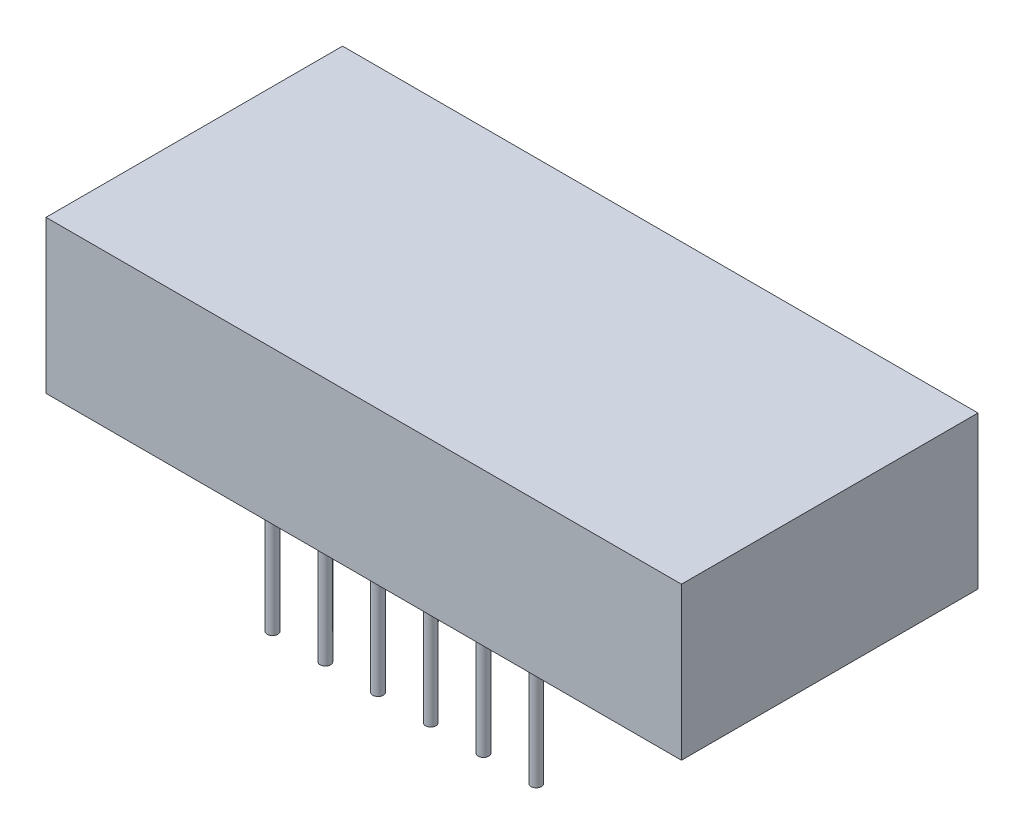
ISO-10303-21;
HEADER;
FILE_DESCRIPTION(('STEP AP214'),'2;1');
FILE_NAME('part.step','',(''),(''),'','','');
FILE_SCHEMA(('AUTOMOTIVE_DESIGN { 1 0 10303 214 1 1 1 1 }'));
ENDSEC;
DATA;
#1=APPLICATION_CONTEXT('core data for automotive mechanical design processes');
#2=APPLICATION_PROTOCOL_DEFINITION('international standard','automotive_design',2000,#1);
#3=PRODUCT_CONTEXT('',#1,'mechanical');
#4=PRODUCT('Part','Part','',(#3));
#5=PRODUCT_RELATED_PRODUCT_CATEGORY('part','',(#4));
#6=PRODUCT_DEFINITION_FORMATION('','',#4);
#7=PRODUCT_DEFINITION_CONTEXT('part definition',#1,'design');
#8=PRODUCT_DEFINITION('design','',#6,#7);
#9=PRODUCT_DEFINITION_SHAPE('','',#8);
#10=(LENGTH_UNIT() NAMED_UNIT(*) SI_UNIT(.MILLI.,.METRE.));
#11=(NAMED_UNIT(*) PLANE_ANGLE_UNIT() SI_UNIT($,.RADIAN.));
#12=(NAMED_UNIT(*) SI_UNIT($,.STERADIAN.) SOLID_ANGLE_UNIT());
#13=UNCERTAINTY_MEASURE_WITH_UNIT(LENGTH_MEASURE(1.E-05),#10,'distance_accuracy_value','');
#14=(GEOMETRIC_REPRESENTATION_CONTEXT(3) GLOBAL_UNCERTAINTY_ASSIGNED_CONTEXT((#13)) GLOBAL_UNIT_ASSIGNED_CONTEXT((#10,
#11,#12)) REPRESENTATION_CONTEXT('',''));
#15=CARTESIAN_POINT('',(0.,0.,0.));
#16=DIRECTION('',(0.,0.,1.));
#17=DIRECTION('',(1.,0.,0.));
#18=AXIS2_PLACEMENT_3D('',#15,#16,#17);
#19=CARTESIAN_POINT('',(-15.,0.,7.));
#20=DIRECTION('',(0.,1.,0.));
#21=DIRECTION('',(0.,0.,1.));
#22=AXIS2_PLACEMENT_3D('',#19,#20,#21);
#23=PLANE('',#22);
#24=CARTESIAN_POINT('',(3.73481199421592,0.,-5.08000000000001));
#25=DIRECTION('',(0.,1.,0.));
#26=DIRECTION('',(0.,0.,1.));
#27=AXIS2_PLACEMENT_3D('',#24,#25,#26);
#28=CIRCLE('',#27,0.250000000000002);
#29=CARTESIAN_POINT('',(3.73481199421592,0.,-4.83));
#30=VERTEX_POINT('',#29);
#31=EDGE_CURVE('E42',#30,#30,#28,.F.);
#32=ORIENTED_EDGE('',*,*,#31,.F.);
#33=EDGE_LOOP('',(#32));
#34=FACE_BOUND('',#33,.T.);
#35=CARTESIAN_POINT('',(-1.2449373314053,0.,-5.08000000000001));
#36=DIRECTION('',(0.,1.,0.));
#37=DIRECTION('',(0.,0.,1.));
#38=AXIS2_PLACEMENT_3D('',#35,#36,#37);
#39=CIRCLE('',#38,0.25);
#40=CARTESIAN_POINT('',(-1.2449373314053,0.,-4.83000000000001));
#41=VERTEX_POINT('',#40);
#42=EDGE_CURVE('E135',#41,#41,#39,.F.);
#43=ORIENTED_EDGE('',*,*,#42,.F.);
#44=EDGE_LOOP('',(#43));
#45=FACE_BOUND('',#44,.T.);
#46=CARTESIAN_POINT('',(-6.22468665702653,0.,-5.08000000000001));
#47=DIRECTION('',(0.,1.,0.));
#48=DIRECTION('',(0.,0.,1.));
#49=AXIS2_PLACEMENT_3D('',#46,#47,#48);
#50=CIRCLE('',#49,0.25);
#51=CARTESIAN_POINT('',(-6.22468665702653,0.,-4.83000000000001));
#52=VERTEX_POINT('',#51);
#53=EDGE_CURVE('E129',#52,#52,#50,.F.);
#54=ORIENTED_EDGE('',*,*,#53,.F.);
#55=EDGE_LOOP('',(#54));
#56=FACE_BOUND('',#55,.T.);
#57=CARTESIAN_POINT('',(-3.73481199421592,0.,5.08));
#58=DIRECTION('',(0.,1.,0.));
#59=DIRECTION('',(0.,0.,1.));
#60=AXIS2_PLACEMENT_3D('',#57,#58,#59);
#61=CIRCLE('',#60,0.25);
#62=CARTESIAN_POINT('',(-3.73481199421592,0.,5.33));
#63=VERTEX_POINT('',#62);
#64=EDGE_CURVE('E123',#63,#63,#61,.F.);
#65=ORIENTED_EDGE('',*,*,#64,.F.);
#66=EDGE_LOOP('',(#65));
#67=FACE_BOUND('',#66,.T.);
#68=CARTESIAN_POINT('',(1.2449373314053,0.,5.08));
#69=DIRECTION('',(0.,1.,0.));
#70=DIRECTION('',(0.,0.,1.));
#71=AXIS2_PLACEMENT_3D('',#68,#69,#70);
#72=CIRCLE('',#71,0.25);
#73=CARTESIAN_POINT('',(1.2449373314053,0.,5.33));
#74=VERTEX_POINT('',#73);
#75=EDGE_CURVE('E117',#74,#74,#72,.F.);
#76=ORIENTED_EDGE('',*,*,#75,.F.);
#77=EDGE_LOOP('',(#76));
#78=FACE_BOUND('',#77,.T.);
#79=CARTESIAN_POINT('',(6.22468665702653,0.,5.08));
#80=DIRECTION('',(0.,1.,0.));
#81=DIRECTION('',(0.,0.,1.));
#82=AXIS2_PLACEMENT_3D('',#79,#80,#81);
#83=CIRCLE('',#82,0.25);
#84=CARTESIAN_POINT('',(6.22468665702653,0.,5.33));
#85=VERTEX_POINT('',#84);
#86=EDGE_CURVE('E111',#85,#85,#83,.F.);
#87=ORIENTED_EDGE('',*,*,#86,.F.);
#88=EDGE_LOOP('',(#87));
#89=FACE_BOUND('',#88,.T.);
#90=DIRECTION('',(0.,0.,1.));
#91=VECTOR('',#90,1.);
#92=CARTESIAN_POINT('',(-15.,0.,-7.));
#93=LINE('',#92,#91);
#94=CARTESIAN_POINT('',(-15.,0.,-7.));
#95=VERTEX_POINT('',#94);
#96=CARTESIAN_POINT('',(-15.,0.,7.));
#97=VERTEX_POINT('',#96);
#98=EDGE_CURVE('E101',#95,#97,#93,.T.);
#99=ORIENTED_EDGE('',*,*,#98,.F.);
#100=DIRECTION('',(-1.,0.,0.));
#101=VECTOR('',#100,1.);
#102=CARTESIAN_POINT('',(-15.,0.,-7.));
#103=LINE('',#102,#101);
#104=CARTESIAN_POINT('',(15.,0.,-7.));
#105=VERTEX_POINT('',#104);
#106=EDGE_CURVE('E73',#105,#95,#103,.T.);
#107=ORIENTED_EDGE('',*,*,#106,.F.);
#108=DIRECTION('',(0.,0.,-1.));
#109=VECTOR('',#108,1.);
#110=CARTESIAN_POINT('',(15.,0.,-7.));
#111=LINE('',#110,#109);
#112=CARTESIAN_POINT('',(15.,0.,7.));
#113=VERTEX_POINT('',#112);
#114=EDGE_CURVE('E67',#113,#105,#111,.T.);
#115=ORIENTED_EDGE('',*,*,#114,.F.);
#116=DIRECTION('',(1.,0.,0.));
#117=VECTOR('',#116,1.);
#118=CARTESIAN_POINT('',(-15.,0.,7.));
#119=LINE('',#118,#117);
#120=EDGE_CURVE('E91',#97,#113,#119,.T.);
#121=ORIENTED_EDGE('',*,*,#120,.F.);
#122=EDGE_LOOP('',(#99,#107,#115,#121));
#123=FACE_BOUND('',#122,.T.);
#124=CARTESIAN_POINT('',(3.73481199421592,0.,5.08));
#125=DIRECTION('',(0.,1.,0.));
#126=DIRECTION('',(0.,0.,1.));
#127=AXIS2_PLACEMENT_3D('',#124,#125,#126);
#128=CIRCLE('',#127,0.250000000000001);
#129=CARTESIAN_POINT('',(3.73481199421592,0.,5.33));
#130=VERTEX_POINT('',#129);
#131=EDGE_CURVE('E114',#130,#130,#128,.F.);
#132=ORIENTED_EDGE('',*,*,#131,.F.);
#133=EDGE_LOOP('',(#132));
#134=FACE_BOUND('',#133,.T.);
#135=CARTESIAN_POINT('',(-1.24493733140531,0.,5.08));
#136=DIRECTION('',(0.,1.,0.));
#137=DIRECTION('',(0.,0.,1.));
#138=AXIS2_PLACEMENT_3D('',#135,#136,#137);
#139=CIRCLE('',#138,0.25);
#140=CARTESIAN_POINT('',(-1.24493733140531,0.,5.33));
#141=VERTEX_POINT('',#140);
#142=EDGE_CURVE('E120',#141,#141,#139,.F.);
#143=ORIENTED_EDGE('',*,*,#142,.F.);
#144=EDGE_LOOP('',(#143));
#145=FACE_BOUND('',#144,.T.);
#146=CARTESIAN_POINT('',(-6.22468665702653,0.,5.08));
#147=DIRECTION('',(0.,1.,0.));
#148=DIRECTION('',(0.,0.,1.));
#149=AXIS2_PLACEMENT_3D('',#146,#147,#148);
#150=CIRCLE('',#149,0.25);
#151=CARTESIAN_POINT('',(-6.22468665702653,0.,5.33));
#152=VERTEX_POINT('',#151);
#153=EDGE_CURVE('E126',#152,#152,#150,.F.);
#154=ORIENTED_EDGE('',*,*,#153,.F.);
#155=EDGE_LOOP('',(#154));
#156=FACE_BOUND('',#155,.T.);
#157=CARTESIAN_POINT('',(-3.73481199421592,0.,-5.08000000000001));
#158=DIRECTION('',(0.,1.,0.));
#159=DIRECTION('',(0.,0.,1.));
#160=AXIS2_PLACEMENT_3D('',#157,#158,#159);
#161=CIRCLE('',#160,0.250000000000001);
#162=CARTESIAN_POINT('',(-3.73481199421592,0.,-4.83000000000001));
#163=VERTEX_POINT('',#162);
#164=EDGE_CURVE('E132',#163,#163,#161,.F.);
#165=ORIENTED_EDGE('',*,*,#164,.F.);
#166=EDGE_LOOP('',(#165));
#167=FACE_BOUND('',#166,.T.);
#168=CARTESIAN_POINT('',(1.24493733140531,0.,-5.08000000000001));
#169=DIRECTION('',(0.,1.,0.));
#170=DIRECTION('',(0.,0.,1.));
#171=AXIS2_PLACEMENT_3D('',#168,#169,#170);
#172=CIRCLE('',#171,0.25);
#173=CARTESIAN_POINT('',(1.24493733140531,0.,-4.83000000000001));
#174=VERTEX_POINT('',#173);
#175=EDGE_CURVE('E138',#174,#174,#172,.F.);
#176=ORIENTED_EDGE('',*,*,#175,.F.);
#177=EDGE_LOOP('',(#176));
#178=FACE_BOUND('',#177,.T.);
#179=CARTESIAN_POINT('',(6.22468665702653,0.,-5.08));
#180=DIRECTION('',(0.,1.,0.));
#181=DIRECTION('',(0.,0.,1.));
#182=AXIS2_PLACEMENT_3D('',#179,#180,#181);
#183=CIRCLE('',#182,0.25);
#184=CARTESIAN_POINT('',(6.22468665702653,0.,-4.83));
#185=VERTEX_POINT('',#184);
#186=EDGE_CURVE('E11',#185,#185,#183,.F.);
#187=ORIENTED_EDGE('',*,*,#186,.F.);
#188=EDGE_LOOP('',(#187));
#189=FACE_BOUND('',#188,.T.);
#190=ADVANCED_FACE('F33',(#34,#45,#56,#67,#78,#89,#123,#134,#145,#156,#167,#178,#189),#23,.F.);
#191=CARTESIAN_POINT('',(-15.,7.2,-7.));
#192=DIRECTION('',(1.,0.,0.));
#193=DIRECTION('',(0.,0.,-1.));
#194=AXIS2_PLACEMENT_3D('',#191,#192,#193);
#195=PLANE('',#194);
#196=ORIENTED_EDGE('',*,*,#98,.T.);
#197=DIRECTION('',(0.,-1.,0.));
#198=VECTOR('',#197,1.);
#199=CARTESIAN_POINT('',(-15.,7.2,7.));
#200=LINE('',#199,#198);
#201=CARTESIAN_POINT('',(-15.,7.2,7.));
#202=VERTEX_POINT('',#201);
#203=EDGE_CURVE('E92',#202,#97,#200,.T.);
#204=ORIENTED_EDGE('',*,*,#203,.F.);
#205=DIRECTION('',(0.,0.,1.));
#206=VECTOR('',#205,1.);
#207=CARTESIAN_POINT('',(-15.,7.2,-7.));
#208=LINE('',#207,#206);
#209=CARTESIAN_POINT('',(-15.,7.2,-7.));
#210=VERTEX_POINT('',#209);
#211=EDGE_CURVE('E86',#210,#202,#208,.T.);
#212=ORIENTED_EDGE('',*,*,#211,.F.);
#213=DIRECTION('',(0.,-1.,0.));
#214=VECTOR('',#213,1.);
#215=CARTESIAN_POINT('',(-15.,7.2,-7.));
#216=LINE('',#215,#214);
#217=EDGE_CURVE('E97',#210,#95,#216,.T.);
#218=ORIENTED_EDGE('',*,*,#217,.T.);
#219=EDGE_LOOP('',(#196,#204,#212,#218));
#220=FACE_BOUND('',#219,.T.);
#221=ADVANCED_FACE('F35',(#220),#195,.F.);
#222=CARTESIAN_POINT('',(-15.,7.2,7.));
#223=DIRECTION('',(0.,0.,-1.));
#224=DIRECTION('',(-1.,0.,0.));
#225=AXIS2_PLACEMENT_3D('',#222,#223,#224);
#226=PLANE('',#225);
#227=ORIENTED_EDGE('',*,*,#120,.T.);
#228=DIRECTION('',(0.,-1.,0.));
#229=VECTOR('',#228,1.);
#230=CARTESIAN_POINT('',(15.,7.2,7.));
#231=LINE('',#230,#229);
#232=CARTESIAN_POINT('',(15.,7.2,7.));
#233=VERTEX_POINT('',#232);
#234=EDGE_CURVE('E89',#233,#113,#231,.T.);
#235=ORIENTED_EDGE('',*,*,#234,.F.);
#236=DIRECTION('',(1.,0.,0.));
#237=VECTOR('',#236,1.);
#238=CARTESIAN_POINT('',(-15.,7.2,7.));
#239=LINE('',#238,#237);
#240=EDGE_CURVE('E81',#202,#233,#239,.T.);
#241=ORIENTED_EDGE('',*,*,#240,.F.);
#242=ORIENTED_EDGE('',*,*,#203,.T.);
#243=EDGE_LOOP('',(#227,#235,#241,#242));
#244=FACE_BOUND('',#243,.T.);
#245=ADVANCED_FACE('F90',(#244),#226,.F.);
#246=CARTESIAN_POINT('',(15.,7.2,-7.));
#247=DIRECTION('',(-1.,0.,0.));
#248=DIRECTION('',(0.,0.,1.));
#249=AXIS2_PLACEMENT_3D('',#246,#247,#248);
#250=PLANE('',#249);
#251=ORIENTED_EDGE('',*,*,#114,.T.);
#252=DIRECTION('',(0.,-1.,0.));
#253=VECTOR('',#252,1.);
#254=CARTESIAN_POINT('',(15.,7.2,-7.));
#255=LINE('',#254,#253);
#256=CARTESIAN_POINT('',(15.,7.2,-7.));
#257=VERTEX_POINT('',#256);
#258=EDGE_CURVE('E93',#257,#105,#255,.T.);
#259=ORIENTED_EDGE('',*,*,#258,.F.);
#260=DIRECTION('',(0.,0.,-1.));
#261=VECTOR('',#260,1.);
#262=CARTESIAN_POINT('',(15.,7.2,-7.));
#263=LINE('',#262,#261);
#264=EDGE_CURVE('E84',#233,#257,#263,.T.);
#265=ORIENTED_EDGE('',*,*,#264,.F.);
#266=ORIENTED_EDGE('',*,*,#234,.T.);
#267=EDGE_LOOP('',(#251,#259,#265,#266));
#268=FACE_BOUND('',#267,.T.);
#269=ADVANCED_FACE('F95',(#268),#250,.F.);
#270=CARTESIAN_POINT('',(-15.,7.2,-7.));
#271=DIRECTION('',(0.,0.,1.));
#272=DIRECTION('',(1.,0.,0.));
#273=AXIS2_PLACEMENT_3D('',#270,#271,#272);
#274=PLANE('',#273);
#275=ORIENTED_EDGE('',*,*,#106,.T.);
#276=ORIENTED_EDGE('',*,*,#217,.F.);
#277=DIRECTION('',(-1.,0.,0.));
#278=VECTOR('',#277,1.);
#279=CARTESIAN_POINT('',(-15.,7.2,-7.));
#280=LINE('',#279,#278);
#281=EDGE_CURVE('E50',#257,#210,#280,.T.);
#282=ORIENTED_EDGE('',*,*,#281,.F.);
#283=ORIENTED_EDGE('',*,*,#258,.T.);
#284=EDGE_LOOP('',(#275,#276,#282,#283));
#285=FACE_BOUND('',#284,.T.);
#286=ADVANCED_FACE('F272',(#285),#274,.F.);
#287=CARTESIAN_POINT('',(-15.,7.2,7.));
#288=DIRECTION('',(0.,1.,0.));
#289=DIRECTION('',(0.,0.,1.));
#290=AXIS2_PLACEMENT_3D('',#287,#288,#289);
#291=PLANE('',#290);
#292=ORIENTED_EDGE('',*,*,#211,.T.);
#293=ORIENTED_EDGE('',*,*,#240,.T.);
#294=ORIENTED_EDGE('',*,*,#264,.T.);
#295=ORIENTED_EDGE('',*,*,#281,.T.);
#296=EDGE_LOOP('',(#292,#293,#294,#295));
#297=FACE_BOUND('',#296,.T.);
#298=ADVANCED_FACE('F82',(#297),#291,.T.);
#299=CARTESIAN_POINT('',(6.22468665702653,-6.3,5.08));
#300=DIRECTION('',(0.,1.,0.));
#301=DIRECTION('',(0.,0.,1.));
#302=AXIS2_PLACEMENT_3D('',#299,#300,#301);
#303=CYLINDRICAL_SURFACE('',#302,0.25);
#304=CARTESIAN_POINT('',(6.22468665702653,-6.3,5.08));
#305=DIRECTION('',(0.,-1.,0.));
#306=DIRECTION('',(0.,0.,-1.));
#307=AXIS2_PLACEMENT_3D('',#304,#305,#306);
#308=CIRCLE('',#307,0.25);
#309=CARTESIAN_POINT('',(6.22468665702653,-6.3,4.83));
#310=VERTEX_POINT('',#309);
#311=EDGE_CURVE('E104',#310,#310,#308,.T.);
#312=ORIENTED_EDGE('',*,*,#311,.F.);
#313=EDGE_LOOP('',(#312));
#314=FACE_BOUND('',#313,.T.);
#315=ORIENTED_EDGE('',*,*,#86,.T.);
#316=EDGE_LOOP('',(#315));
#317=FACE_BOUND('',#316,.T.);
#318=ADVANCED_FACE('F266',(#314,#317),#303,.T.);
#319=CARTESIAN_POINT('',(6.22468665702653,-6.3,5.08));
#320=DIRECTION('',(0.,-1.,0.));
#321=DIRECTION('',(0.,0.,-1.));
#322=AXIS2_PLACEMENT_3D('',#319,#320,#321);
#323=PLANE('',#322);
#324=ORIENTED_EDGE('',*,*,#311,.T.);
#325=EDGE_LOOP('',(#324));
#326=FACE_BOUND('',#325,.T.);
#327=ADVANCED_FACE('F262',(#326),#323,.T.);
#328=CARTESIAN_POINT('',(3.73481199421592,-6.3,5.08));
#329=DIRECTION('',(0.,1.,0.));
#330=DIRECTION('',(0.,0.,1.));
#331=AXIS2_PLACEMENT_3D('',#328,#329,#330);
#332=CYLINDRICAL_SURFACE('',#331,0.250000000000001);
#333=CARTESIAN_POINT('',(3.73481199421592,-6.3,5.08));
#334=DIRECTION('',(0.,-1.,0.));
#335=DIRECTION('',(0.,0.,-1.));
#336=AXIS2_PLACEMENT_3D('',#333,#334,#335);
#337=CIRCLE('',#336,0.250000000000001);
#338=CARTESIAN_POINT('',(3.73481199421592,-6.3,4.83));
#339=VERTEX_POINT('',#338);
#340=EDGE_CURVE('E287',#339,#339,#337,.T.);
#341=ORIENTED_EDGE('',*,*,#340,.F.);
#342=EDGE_LOOP('',(#341));
#343=FACE_BOUND('',#342,.T.);
#344=ORIENTED_EDGE('',*,*,#131,.T.);
#345=EDGE_LOOP('',(#344));
#346=FACE_BOUND('',#345,.T.);
#347=ADVANCED_FACE('F258',(#343,#346),#332,.T.);
#348=CARTESIAN_POINT('',(3.73481199421592,-6.3,5.08));
#349=DIRECTION('',(0.,-1.,0.));
#350=DIRECTION('',(0.,0.,-1.));
#351=AXIS2_PLACEMENT_3D('',#348,#349,#350);
#352=PLANE('',#351);
#353=ORIENTED_EDGE('',*,*,#340,.T.);
#354=EDGE_LOOP('',(#353));
#355=FACE_BOUND('',#354,.T.);
#356=ADVANCED_FACE('F254',(#355),#352,.T.);
#357=CARTESIAN_POINT('',(1.2449373314053,-6.3,5.08));
#358=DIRECTION('',(0.,1.,0.));
#359=DIRECTION('',(0.,0.,1.));
#360=AXIS2_PLACEMENT_3D('',#357,#358,#359);
#361=CYLINDRICAL_SURFACE('',#360,0.25);
#362=CARTESIAN_POINT('',(1.2449373314053,-6.3,5.08));
#363=DIRECTION('',(0.,-1.,0.));
#364=DIRECTION('',(0.,0.,-1.));
#365=AXIS2_PLACEMENT_3D('',#362,#363,#364);
#366=CIRCLE('',#365,0.25);
#367=CARTESIAN_POINT('',(1.2449373314053,-6.3,4.83));
#368=VERTEX_POINT('',#367);
#369=EDGE_CURVE('E290',#368,#368,#366,.T.);
#370=ORIENTED_EDGE('',*,*,#369,.F.);
#371=EDGE_LOOP('',(#370));
#372=FACE_BOUND('',#371,.T.);
#373=ORIENTED_EDGE('',*,*,#75,.T.);
#374=EDGE_LOOP('',(#373));
#375=FACE_BOUND('',#374,.T.);
#376=ADVANCED_FACE('F250',(#372,#375),#361,.T.);
#377=CARTESIAN_POINT('',(1.2449373314053,-6.3,5.08));
#378=DIRECTION('',(0.,-1.,0.));
#379=DIRECTION('',(0.,0.,-1.));
#380=AXIS2_PLACEMENT_3D('',#377,#378,#379);
#381=PLANE('',#380);
#382=ORIENTED_EDGE('',*,*,#369,.T.);
#383=EDGE_LOOP('',(#382));
#384=FACE_BOUND('',#383,.T.);
#385=ADVANCED_FACE('F246',(#384),#381,.T.);
#386=CARTESIAN_POINT('',(-1.24493733140531,-6.3,5.08));
#387=DIRECTION('',(0.,1.,0.));
#388=DIRECTION('',(0.,0.,1.));
#389=AXIS2_PLACEMENT_3D('',#386,#387,#388);
#390=CYLINDRICAL_SURFACE('',#389,0.25);
#391=CARTESIAN_POINT('',(-1.24493733140531,-6.3,5.08));
#392=DIRECTION('',(0.,-1.,0.));
#393=DIRECTION('',(0.,0.,-1.));
#394=AXIS2_PLACEMENT_3D('',#391,#392,#393);
#395=CIRCLE('',#394,0.25);
#396=CARTESIAN_POINT('',(-1.24493733140531,-6.3,4.83));
#397=VERTEX_POINT('',#396);
#398=EDGE_CURVE('E293',#397,#397,#395,.T.);
#399=ORIENTED_EDGE('',*,*,#398,.F.);
#400=EDGE_LOOP('',(#399));
#401=FACE_BOUND('',#400,.T.);
#402=ORIENTED_EDGE('',*,*,#142,.T.);
#403=EDGE_LOOP('',(#402));
#404=FACE_BOUND('',#403,.T.);
#405=ADVANCED_FACE('F242',(#401,#404),#390,.T.);
#406=CARTESIAN_POINT('',(-1.24493733140531,-6.3,5.08));
#407=DIRECTION('',(0.,-1.,0.));
#408=DIRECTION('',(0.,0.,-1.));
#409=AXIS2_PLACEMENT_3D('',#406,#407,#408);
#410=PLANE('',#409);
#411=ORIENTED_EDGE('',*,*,#398,.T.);
#412=EDGE_LOOP('',(#411));
#413=FACE_BOUND('',#412,.T.);
#414=ADVANCED_FACE('F238',(#413),#410,.T.);
#415=CARTESIAN_POINT('',(-3.73481199421592,-6.3,5.08));
#416=DIRECTION('',(0.,1.,0.));
#417=DIRECTION('',(0.,0.,1.));
#418=AXIS2_PLACEMENT_3D('',#415,#416,#417);
#419=CYLINDRICAL_SURFACE('',#418,0.25);
#420=CARTESIAN_POINT('',(-3.73481199421592,-6.3,5.08));
#421=DIRECTION('',(0.,-1.,0.));
#422=DIRECTION('',(0.,0.,-1.));
#423=AXIS2_PLACEMENT_3D('',#420,#421,#422);
#424=CIRCLE('',#423,0.25);
#425=CARTESIAN_POINT('',(-3.73481199421592,-6.3,4.83));
#426=VERTEX_POINT('',#425);
#427=EDGE_CURVE('E296',#426,#426,#424,.T.);
#428=ORIENTED_EDGE('',*,*,#427,.F.);
#429=EDGE_LOOP('',(#428));
#430=FACE_BOUND('',#429,.T.);
#431=ORIENTED_EDGE('',*,*,#64,.T.);
#432=EDGE_LOOP('',(#431));
#433=FACE_BOUND('',#432,.T.);
#434=ADVANCED_FACE('F234',(#430,#433),#419,.T.);
#435=CARTESIAN_POINT('',(-3.73481199421592,-6.3,5.08));
#436=DIRECTION('',(0.,-1.,0.));
#437=DIRECTION('',(0.,0.,-1.));
#438=AXIS2_PLACEMENT_3D('',#435,#436,#437);
#439=PLANE('',#438);
#440=ORIENTED_EDGE('',*,*,#427,.T.);
#441=EDGE_LOOP('',(#440));
#442=FACE_BOUND('',#441,.T.);
#443=ADVANCED_FACE('F230',(#442),#439,.T.);
#444=CARTESIAN_POINT('',(-6.22468665702653,-6.3,5.08));
#445=DIRECTION('',(0.,1.,0.));
#446=DIRECTION('',(0.,0.,1.));
#447=AXIS2_PLACEMENT_3D('',#444,#445,#446);
#448=CYLINDRICAL_SURFACE('',#447,0.25);
#449=CARTESIAN_POINT('',(-6.22468665702653,-6.3,5.08));
#450=DIRECTION('',(0.,-1.,0.));
#451=DIRECTION('',(0.,0.,-1.));
#452=AXIS2_PLACEMENT_3D('',#449,#450,#451);
#453=CIRCLE('',#452,0.25);
#454=CARTESIAN_POINT('',(-6.22468665702653,-6.3,4.83));
#455=VERTEX_POINT('',#454);
#456=EDGE_CURVE('E299',#455,#455,#453,.T.);
#457=ORIENTED_EDGE('',*,*,#456,.F.);
#458=EDGE_LOOP('',(#457));
#459=FACE_BOUND('',#458,.T.);
#460=ORIENTED_EDGE('',*,*,#153,.T.);
#461=EDGE_LOOP('',(#460));
#462=FACE_BOUND('',#461,.T.);
#463=ADVANCED_FACE('F226',(#459,#462),#448,.T.);
#464=CARTESIAN_POINT('',(-6.22468665702653,-6.3,5.08));
#465=DIRECTION('',(0.,-1.,0.));
#466=DIRECTION('',(0.,0.,-1.));
#467=AXIS2_PLACEMENT_3D('',#464,#465,#466);
#468=PLANE('',#467);
#469=ORIENTED_EDGE('',*,*,#456,.T.);
#470=EDGE_LOOP('',(#469));
#471=FACE_BOUND('',#470,.T.);
#472=ADVANCED_FACE('F222',(#471),#468,.T.);
#473=CARTESIAN_POINT('',(-6.22468665702653,-6.3,-5.08000000000001));
#474=DIRECTION('',(0.,1.,0.));
#475=DIRECTION('',(0.,0.,1.));
#476=AXIS2_PLACEMENT_3D('',#473,#474,#475);
#477=CYLINDRICAL_SURFACE('',#476,0.25);
#478=CARTESIAN_POINT('',(-6.22468665702653,-6.3,-5.08000000000001));
#479=DIRECTION('',(0.,-1.,0.));
#480=DIRECTION('',(0.,0.,1.));
#481=AXIS2_PLACEMENT_3D('',#478,#479,#480);
#482=CIRCLE('',#481,0.25);
#483=CARTESIAN_POINT('',(-6.22468665702653,-6.3,-4.83000000000001));
#484=VERTEX_POINT('',#483);
#485=EDGE_CURVE('E302',#484,#484,#482,.T.);
#486=ORIENTED_EDGE('',*,*,#485,.F.);
#487=EDGE_LOOP('',(#486));
#488=FACE_BOUND('',#487,.T.);
#489=ORIENTED_EDGE('',*,*,#53,.T.);
#490=EDGE_LOOP('',(#489));
#491=FACE_BOUND('',#490,.T.);
#492=ADVANCED_FACE('F218',(#488,#491),#477,.T.);
#493=CARTESIAN_POINT('',(-6.22468665702653,-6.3,-5.08000000000001));
#494=DIRECTION('',(0.,1.,0.));
#495=DIRECTION('',(0.,0.,1.));
#496=AXIS2_PLACEMENT_3D('',#493,#494,#495);
#497=PLANE('',#496);
#498=ORIENTED_EDGE('',*,*,#485,.T.);
#499=EDGE_LOOP('',(#498));
#500=FACE_BOUND('',#499,.T.);
#501=ADVANCED_FACE('F214',(#500),#497,.F.);
#502=CARTESIAN_POINT('',(-3.73481199421592,-6.3,-5.08000000000001));
#503=DIRECTION('',(0.,1.,0.));
#504=DIRECTION('',(0.,0.,1.));
#505=AXIS2_PLACEMENT_3D('',#502,#503,#504);
#506=CYLINDRICAL_SURFACE('',#505,0.250000000000001);
#507=CARTESIAN_POINT('',(-3.73481199421592,-6.3,-5.08000000000001));
#508=DIRECTION('',(0.,-1.,0.));
#509=DIRECTION('',(0.,0.,1.));
#510=AXIS2_PLACEMENT_3D('',#507,#508,#509);
#511=CIRCLE('',#510,0.250000000000001);
#512=CARTESIAN_POINT('',(-3.73481199421592,-6.3,-4.83000000000001));
#513=VERTEX_POINT('',#512);
#514=EDGE_CURVE('E305',#513,#513,#511,.T.);
#515=ORIENTED_EDGE('',*,*,#514,.F.);
#516=EDGE_LOOP('',(#515));
#517=FACE_BOUND('',#516,.T.);
#518=ORIENTED_EDGE('',*,*,#164,.T.);
#519=EDGE_LOOP('',(#518));
#520=FACE_BOUND('',#519,.T.);
#521=ADVANCED_FACE('F210',(#517,#520),#506,.T.);
#522=CARTESIAN_POINT('',(-3.73481199421592,-6.3,-5.08000000000001));
#523=DIRECTION('',(0.,1.,0.));
#524=DIRECTION('',(0.,0.,1.));
#525=AXIS2_PLACEMENT_3D('',#522,#523,#524);
#526=PLANE('',#525);
#527=ORIENTED_EDGE('',*,*,#514,.T.);
#528=EDGE_LOOP('',(#527));
#529=FACE_BOUND('',#528,.T.);
#530=ADVANCED_FACE('F206',(#529),#526,.F.);
#531=CARTESIAN_POINT('',(-1.2449373314053,-6.3,-5.08000000000001));
#532=DIRECTION('',(0.,1.,0.));
#533=DIRECTION('',(0.,0.,1.));
#534=AXIS2_PLACEMENT_3D('',#531,#532,#533);
#535=CYLINDRICAL_SURFACE('',#534,0.25);
#536=CARTESIAN_POINT('',(-1.2449373314053,-6.3,-5.08000000000001));
#537=DIRECTION('',(0.,-1.,0.));
#538=DIRECTION('',(0.,0.,1.));
#539=AXIS2_PLACEMENT_3D('',#536,#537,#538);
#540=CIRCLE('',#539,0.25);
#541=CARTESIAN_POINT('',(-1.2449373314053,-6.3,-4.83000000000001));
#542=VERTEX_POINT('',#541);
#543=EDGE_CURVE('E308',#542,#542,#540,.T.);
#544=ORIENTED_EDGE('',*,*,#543,.F.);
#545=EDGE_LOOP('',(#544));
#546=FACE_BOUND('',#545,.T.);
#547=ORIENTED_EDGE('',*,*,#42,.T.);
#548=EDGE_LOOP('',(#547));
#549=FACE_BOUND('',#548,.T.);
#550=ADVANCED_FACE('F202',(#546,#549),#535,.T.);
#551=CARTESIAN_POINT('',(-1.2449373314053,-6.3,-5.08000000000001));
#552=DIRECTION('',(0.,1.,0.));
#553=DIRECTION('',(0.,0.,1.));
#554=AXIS2_PLACEMENT_3D('',#551,#552,#553);
#555=PLANE('',#554);
#556=ORIENTED_EDGE('',*,*,#543,.T.);
#557=EDGE_LOOP('',(#556));
#558=FACE_BOUND('',#557,.T.);
#559=ADVANCED_FACE('F198',(#558),#555,.F.);
#560=CARTESIAN_POINT('',(1.24493733140531,-6.3,-5.08000000000001));
#561=DIRECTION('',(0.,1.,0.));
#562=DIRECTION('',(0.,0.,1.));
#563=AXIS2_PLACEMENT_3D('',#560,#561,#562);
#564=CYLINDRICAL_SURFACE('',#563,0.25);
#565=CARTESIAN_POINT('',(1.24493733140531,-6.3,-5.08000000000001));
#566=DIRECTION('',(0.,-1.,0.));
#567=DIRECTION('',(0.,0.,1.));
#568=AXIS2_PLACEMENT_3D('',#565,#566,#567);
#569=CIRCLE('',#568,0.25);
#570=CARTESIAN_POINT('',(1.24493733140531,-6.3,-4.83000000000001));
#571=VERTEX_POINT('',#570);
#572=EDGE_CURVE('E311',#571,#571,#569,.T.);
#573=ORIENTED_EDGE('',*,*,#572,.F.);
#574=EDGE_LOOP('',(#573));
#575=FACE_BOUND('',#574,.T.);
#576=ORIENTED_EDGE('',*,*,#175,.T.);
#577=EDGE_LOOP('',(#576));
#578=FACE_BOUND('',#577,.T.);
#579=ADVANCED_FACE('F194',(#575,#578),#564,.T.);
#580=CARTESIAN_POINT('',(1.24493733140531,-6.3,-5.08000000000001));
#581=DIRECTION('',(0.,1.,0.));
#582=DIRECTION('',(0.,0.,1.));
#583=AXIS2_PLACEMENT_3D('',#580,#581,#582);
#584=PLANE('',#583);
#585=ORIENTED_EDGE('',*,*,#572,.T.);
#586=EDGE_LOOP('',(#585));
#587=FACE_BOUND('',#586,.T.);
#588=ADVANCED_FACE('F190',(#587),#584,.F.);
#589=CARTESIAN_POINT('',(3.73481199421592,-6.3,-5.08000000000001));
#590=DIRECTION('',(0.,1.,0.));
#591=DIRECTION('',(0.,0.,1.));
#592=AXIS2_PLACEMENT_3D('',#589,#590,#591);
#593=CYLINDRICAL_SURFACE('',#592,0.250000000000002);
#594=CARTESIAN_POINT('',(3.73481199421592,-6.3,-5.08000000000001));
#595=DIRECTION('',(0.,-1.,0.));
#596=DIRECTION('',(0.,0.,1.));
#597=AXIS2_PLACEMENT_3D('',#594,#595,#596);
#598=CIRCLE('',#597,0.250000000000002);
#599=CARTESIAN_POINT('',(3.73481199421592,-6.3,-4.83));
#600=VERTEX_POINT('',#599);
#601=EDGE_CURVE('E314',#600,#600,#598,.T.);
#602=ORIENTED_EDGE('',*,*,#601,.F.);
#603=EDGE_LOOP('',(#602));
#604=FACE_BOUND('',#603,.T.);
#605=ORIENTED_EDGE('',*,*,#31,.T.);
#606=EDGE_LOOP('',(#605));
#607=FACE_BOUND('',#606,.T.);
#608=ADVANCED_FACE('F143',(#604,#607),#593,.T.);
#609=CARTESIAN_POINT('',(3.73481199421592,-6.3,-5.08000000000001));
#610=DIRECTION('',(0.,1.,0.));
#611=DIRECTION('',(0.,0.,1.));
#612=AXIS2_PLACEMENT_3D('',#609,#610,#611);
#613=PLANE('',#612);
#614=ORIENTED_EDGE('',*,*,#601,.T.);
#615=EDGE_LOOP('',(#614));
#616=FACE_BOUND('',#615,.T.);
#617=ADVANCED_FACE('F175',(#616),#613,.F.);
#618=CARTESIAN_POINT('',(6.22468665702653,-6.3,-5.08));
#619=DIRECTION('',(0.,1.,0.));
#620=DIRECTION('',(0.,0.,1.));
#621=AXIS2_PLACEMENT_3D('',#618,#619,#620);
#622=CYLINDRICAL_SURFACE('',#621,0.25);
#623=CARTESIAN_POINT('',(6.22468665702653,-6.3,-5.08));
#624=DIRECTION('',(0.,-1.,0.));
#625=DIRECTION('',(0.,0.,1.));
#626=AXIS2_PLACEMENT_3D('',#623,#624,#625);
#627=CIRCLE('',#626,0.25);
#628=CARTESIAN_POINT('',(6.22468665702653,-6.3,-4.83));
#629=VERTEX_POINT('',#628);
#630=EDGE_CURVE('E317',#629,#629,#627,.T.);
#631=ORIENTED_EDGE('',*,*,#630,.F.);
#632=EDGE_LOOP('',(#631));
#633=FACE_BOUND('',#632,.T.);
#634=ORIENTED_EDGE('',*,*,#186,.T.);
#635=EDGE_LOOP('',(#634));
#636=FACE_BOUND('',#635,.T.);
#637=ADVANCED_FACE('F172',(#633,#636),#622,.T.);
#638=CARTESIAN_POINT('',(6.22468665702653,-6.3,-5.08));
#639=DIRECTION('',(0.,1.,0.));
#640=DIRECTION('',(0.,0.,1.));
#641=AXIS2_PLACEMENT_3D('',#638,#639,#640);
#642=PLANE('',#641);
#643=ORIENTED_EDGE('',*,*,#630,.T.);
#644=EDGE_LOOP('',(#643));
#645=FACE_BOUND('',#644,.T.);
#646=ADVANCED_FACE('F174',(#645),#642,.F.);
#647=CLOSED_SHELL('',(#190,#221,#245,#269,#286,#298,#318,#327,#347,#356,#376,#385,#405,#414,
#434,#443,#463,#472,#492,#501,#521,#530,#550,#559,#579,#588,#608,#617,#637,#646));
#648=MANIFOLD_SOLID_BREP('B2',#647);
#649=ADVANCED_BREP_SHAPE_REPRESENTATION('',(#18,#648),#14);
#650=SHAPE_DEFINITION_REPRESENTATION(#9,#649);
ENDSEC;
END-ISO-10303-21;
